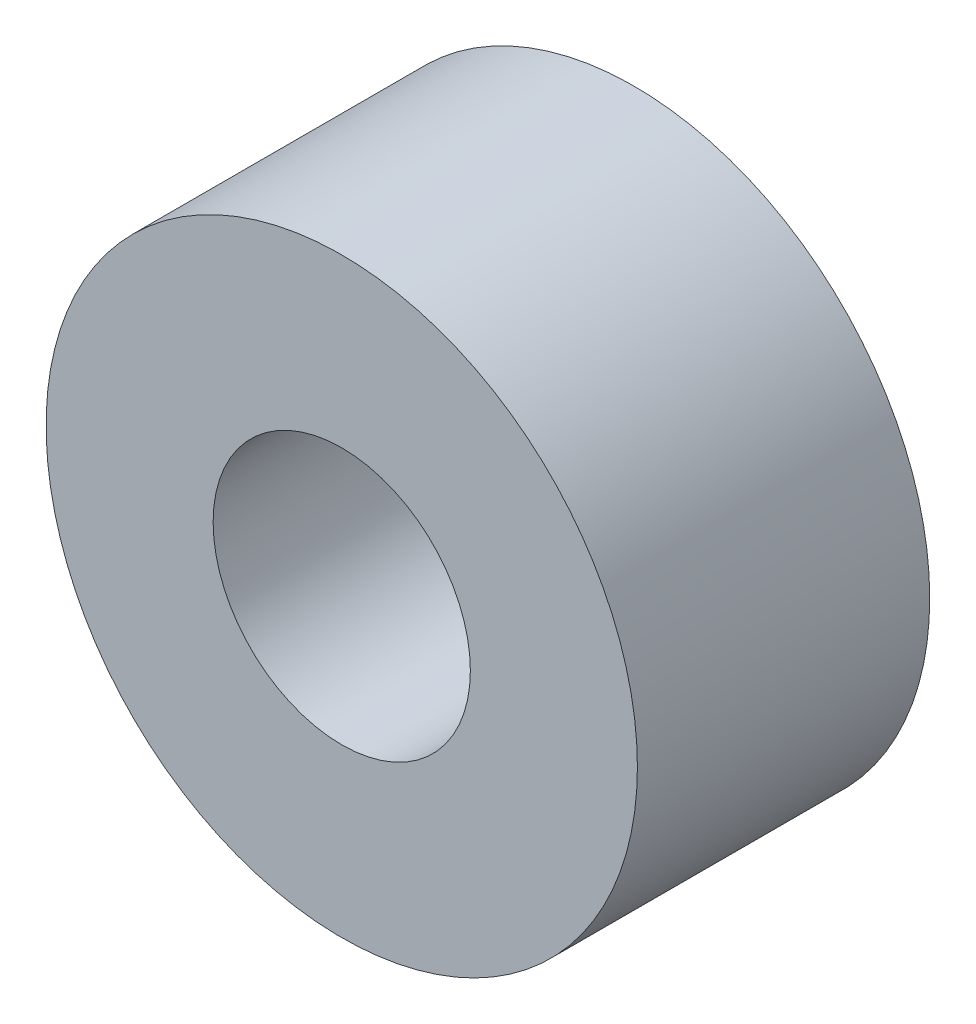
ISO-10303-21;
HEADER;
FILE_DESCRIPTION(('STEP AP214'),'2;1');
FILE_NAME('part.step','',(''),(''),'','','');
FILE_SCHEMA(('AUTOMOTIVE_DESIGN { 1 0 10303 214 1 1 1 1 }'));
ENDSEC;
DATA;
#1=APPLICATION_CONTEXT('core data for automotive mechanical design processes');
#2=APPLICATION_PROTOCOL_DEFINITION('international standard','automotive_design',2000,#1);
#3=PRODUCT_CONTEXT('',#1,'mechanical');
#4=PRODUCT('Part','Part','',(#3));
#5=PRODUCT_RELATED_PRODUCT_CATEGORY('part','',(#4));
#6=PRODUCT_DEFINITION_FORMATION('','',#4);
#7=PRODUCT_DEFINITION_CONTEXT('part definition',#1,'design');
#8=PRODUCT_DEFINITION('design','',#6,#7);
#9=PRODUCT_DEFINITION_SHAPE('','',#8);
#10=(LENGTH_UNIT() NAMED_UNIT(*) SI_UNIT(.MILLI.,.METRE.));
#11=(NAMED_UNIT(*) PLANE_ANGLE_UNIT() SI_UNIT($,.RADIAN.));
#12=(NAMED_UNIT(*) SI_UNIT($,.STERADIAN.) SOLID_ANGLE_UNIT());
#13=UNCERTAINTY_MEASURE_WITH_UNIT(LENGTH_MEASURE(1.E-05),#10,'distance_accuracy_value','');
#14=(GEOMETRIC_REPRESENTATION_CONTEXT(3) GLOBAL_UNCERTAINTY_ASSIGNED_CONTEXT((#13)) GLOBAL_UNIT_ASSIGNED_CONTEXT((#10,
#11,#12)) REPRESENTATION_CONTEXT('',''));
#15=CARTESIAN_POINT('',(0.,0.,0.));
#16=DIRECTION('',(0.,0.,1.));
#17=DIRECTION('',(1.,0.,0.));
#18=AXIS2_PLACEMENT_3D('',#15,#16,#17);
#19=CARTESIAN_POINT('',(0.,0.,11.1125));
#20=DIRECTION('',(0.,0.,1.));
#21=DIRECTION('',(1.,0.,0.));
#22=AXIS2_PLACEMENT_3D('',#19,#20,#21);
#23=PLANE('',#22);
#24=CARTESIAN_POINT('',(0.,0.,11.1125));
#25=DIRECTION('',(0.,0.,1.));
#26=DIRECTION('',(1.,0.,0.));
#27=AXIS2_PLACEMENT_3D('',#24,#25,#26);
#28=CIRCLE('',#27,11.2395);
#29=CARTESIAN_POINT('',(11.2395,0.,11.1125));
#30=VERTEX_POINT('',#29);
#31=EDGE_CURVE('E10',#30,#30,#28,.T.);
#32=ORIENTED_EDGE('',*,*,#31,.T.);
#33=EDGE_LOOP('',(#32));
#34=FACE_BOUND('',#33,.T.);
#35=CARTESIAN_POINT('',(0.,0.,11.1125));
#36=DIRECTION('',(0.,0.,1.));
#37=DIRECTION('',(1.,0.,0.));
#38=AXIS2_PLACEMENT_3D('',#35,#36,#37);
#39=CIRCLE('',#38,4.8895);
#40=CARTESIAN_POINT('',(4.8895,0.,11.1125));
#41=VERTEX_POINT('',#40);
#42=EDGE_CURVE('E44',#41,#41,#39,.T.);
#43=ORIENTED_EDGE('',*,*,#42,.F.);
#44=EDGE_LOOP('',(#43));
#45=FACE_BOUND('',#44,.T.);
#46=ADVANCED_FACE('F33',(#34,#45),#23,.T.);
#47=CARTESIAN_POINT('',(0.,0.,0.));
#48=DIRECTION('',(0.,0.,1.));
#49=DIRECTION('',(1.,0.,0.));
#50=AXIS2_PLACEMENT_3D('',#47,#48,#49);
#51=PLANE('',#50);
#52=CARTESIAN_POINT('',(0.,0.,0.));
#53=DIRECTION('',(0.,0.,1.));
#54=DIRECTION('',(1.,0.,0.));
#55=AXIS2_PLACEMENT_3D('',#52,#53,#54);
#56=CIRCLE('',#55,11.2395);
#57=CARTESIAN_POINT('',(11.2395,0.,0.));
#58=VERTEX_POINT('',#57);
#59=EDGE_CURVE('E37',#58,#58,#56,.T.);
#60=ORIENTED_EDGE('',*,*,#59,.F.);
#61=EDGE_LOOP('',(#60));
#62=FACE_BOUND('',#61,.T.);
#63=CARTESIAN_POINT('',(0.,0.,0.));
#64=DIRECTION('',(0.,0.,1.));
#65=DIRECTION('',(1.,0.,0.));
#66=AXIS2_PLACEMENT_3D('',#63,#64,#65);
#67=CIRCLE('',#66,4.8895);
#68=CARTESIAN_POINT('',(4.8895,0.,0.));
#69=VERTEX_POINT('',#68);
#70=EDGE_CURVE('E46',#69,#69,#67,.T.);
#71=ORIENTED_EDGE('',*,*,#70,.T.);
#72=EDGE_LOOP('',(#71));
#73=FACE_BOUND('',#72,.T.);
#74=ADVANCED_FACE('F56',(#62,#73),#51,.F.);
#75=CARTESIAN_POINT('',(0.,0.,11.1125));
#76=DIRECTION('',(0.,0.,-1.));
#77=DIRECTION('',(-1.,0.,0.));
#78=AXIS2_PLACEMENT_3D('',#75,#76,#77);
#79=CYLINDRICAL_SURFACE('',#78,11.2395);
#80=ORIENTED_EDGE('',*,*,#31,.F.);
#81=EDGE_LOOP('',(#80));
#82=FACE_BOUND('',#81,.T.);
#83=ORIENTED_EDGE('',*,*,#59,.T.);
#84=EDGE_LOOP('',(#83));
#85=FACE_BOUND('',#84,.T.);
#86=ADVANCED_FACE('F35',(#82,#85),#79,.T.);
#87=CARTESIAN_POINT('',(0.,0.,11.1125));
#88=DIRECTION('',(0.,0.,-1.));
#89=DIRECTION('',(-1.,0.,0.));
#90=AXIS2_PLACEMENT_3D('',#87,#88,#89);
#91=CYLINDRICAL_SURFACE('',#90,4.8895);
#92=ORIENTED_EDGE('',*,*,#42,.T.);
#93=EDGE_LOOP('',(#92));
#94=FACE_BOUND('',#93,.T.);
#95=ORIENTED_EDGE('',*,*,#70,.F.);
#96=EDGE_LOOP('',(#95));
#97=FACE_BOUND('',#96,.T.);
#98=ADVANCED_FACE('F52',(#94,#97),#91,.F.);
#99=CLOSED_SHELL('',(#46,#74,#86,#98));
#100=MANIFOLD_SOLID_BREP('B2',#99);
#101=ADVANCED_BREP_SHAPE_REPRESENTATION('',(#18,#100),#14);
#102=SHAPE_DEFINITION_REPRESENTATION(#9,#101);
ENDSEC;
END-ISO-10303-21;
